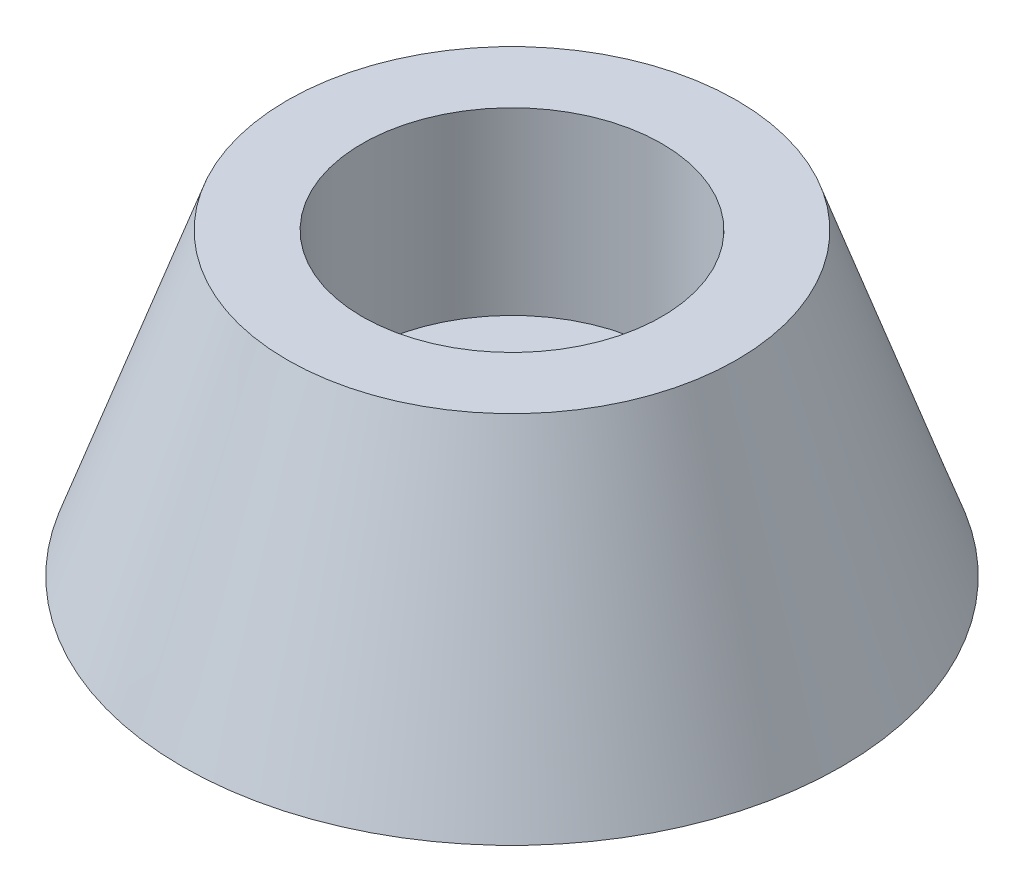
ISO-10303-21;
HEADER;
FILE_DESCRIPTION(('STEP AP214'),'2;1');
FILE_NAME('part.step','',(''),(''),'','','');
FILE_SCHEMA(('AUTOMOTIVE_DESIGN { 1 0 10303 214 1 1 1 1 }'));
ENDSEC;
DATA;
#1=APPLICATION_CONTEXT('core data for automotive mechanical design processes');
#2=APPLICATION_PROTOCOL_DEFINITION('international standard','automotive_design',2000,#1);
#3=PRODUCT_CONTEXT('',#1,'mechanical');
#4=PRODUCT('Part','Part','',(#3));
#5=PRODUCT_RELATED_PRODUCT_CATEGORY('part','',(#4));
#6=PRODUCT_DEFINITION_FORMATION('','',#4);
#7=PRODUCT_DEFINITION_CONTEXT('part definition',#1,'design');
#8=PRODUCT_DEFINITION('design','',#6,#7);
#9=PRODUCT_DEFINITION_SHAPE('','',#8);
#10=(LENGTH_UNIT() NAMED_UNIT(*) SI_UNIT(.MILLI.,.METRE.));
#11=(NAMED_UNIT(*) PLANE_ANGLE_UNIT() SI_UNIT($,.RADIAN.));
#12=(NAMED_UNIT(*) SI_UNIT($,.STERADIAN.) SOLID_ANGLE_UNIT());
#13=UNCERTAINTY_MEASURE_WITH_UNIT(LENGTH_MEASURE(1.E-05),#10,'distance_accuracy_value','');
#14=(GEOMETRIC_REPRESENTATION_CONTEXT(3) GLOBAL_UNCERTAINTY_ASSIGNED_CONTEXT((#13)) GLOBAL_UNIT_ASSIGNED_CONTEXT((#10,
#11,#12)) REPRESENTATION_CONTEXT('',''));
#15=CARTESIAN_POINT('',(0.,0.,0.));
#16=DIRECTION('',(0.,0.,1.));
#17=DIRECTION('',(1.,0.,0.));
#18=AXIS2_PLACEMENT_3D('',#15,#16,#17);
#19=CARTESIAN_POINT('',(0.,-5.63297872340425,0.));
#20=DIRECTION('',(0.,1.,0.));
#21=DIRECTION('',(0.,0.,1.));
#22=AXIS2_PLACEMENT_3D('',#19,#20,#21);
#23=CYLINDRICAL_SURFACE('',#22,2.25);
#24=CARTESIAN_POINT('',(0.,-5.63297872340425,0.));
#25=DIRECTION('',(0.,1.,0.));
#26=DIRECTION('',(0.,0.,1.));
#27=AXIS2_PLACEMENT_3D('',#24,#25,#26);
#28=CIRCLE('',#27,2.25);
#29=CARTESIAN_POINT('',(0.,-5.63297872340425,2.25));
#30=VERTEX_POINT('',#29);
#31=EDGE_CURVE('E44',#30,#30,#28,.T.);
#32=ORIENTED_EDGE('',*,*,#31,.F.);
#33=EDGE_LOOP('',(#32));
#34=FACE_BOUND('',#33,.T.);
#35=CARTESIAN_POINT('',(0.,-1.63297872340425,0.));
#36=DIRECTION('',(0.,1.,0.));
#37=DIRECTION('',(0.,0.,1.));
#38=AXIS2_PLACEMENT_3D('',#35,#36,#37);
#39=CIRCLE('',#38,2.25);
#40=CARTESIAN_POINT('',(0.,-1.63297872340425,2.25));
#41=VERTEX_POINT('',#40);
#42=EDGE_CURVE('E36',#41,#41,#39,.F.);
#43=ORIENTED_EDGE('',*,*,#42,.F.);
#44=EDGE_LOOP('',(#43));
#45=FACE_BOUND('',#44,.T.);
#46=ADVANCED_FACE('F32',(#34,#45),#23,.F.);
#47=CARTESIAN_POINT('',(0.,4.36702127659575,0.));
#48=DIRECTION('',(0.,-1.,0.));
#49=DIRECTION('',(0.,0.,-1.));
#50=AXIS2_PLACEMENT_3D('',#47,#48,#49);
#51=PLANE('',#50);
#52=CARTESIAN_POINT('',(0.,4.36702127659575,0.));
#53=DIRECTION('',(0.,1.,0.));
#54=DIRECTION('',(0.,0.,1.));
#55=AXIS2_PLACEMENT_3D('',#52,#53,#54);
#56=CIRCLE('',#55,5.);
#57=CARTESIAN_POINT('',(0.,4.36702127659575,5.));
#58=VERTEX_POINT('',#57);
#59=EDGE_CURVE('E49',#58,#58,#56,.T.);
#60=ORIENTED_EDGE('',*,*,#59,.F.);
#61=EDGE_LOOP('',(#60));
#62=FACE_BOUND('',#61,.T.);
#63=CARTESIAN_POINT('',(0.,4.36702127659575,0.));
#64=DIRECTION('',(0.,-1.,0.));
#65=DIRECTION('',(0.,0.,-1.));
#66=AXIS2_PLACEMENT_3D('',#63,#64,#65);
#67=CIRCLE('',#66,7.5);
#68=CARTESIAN_POINT('',(0.,4.36702127659575,-7.5));
#69=VERTEX_POINT('',#68);
#70=EDGE_CURVE('E10',#69,#69,#67,.T.);
#71=ORIENTED_EDGE('',*,*,#70,.F.);
#72=EDGE_LOOP('',(#71));
#73=FACE_BOUND('',#72,.T.);
#74=ADVANCED_FACE('F34',(#62,#73),#51,.F.);
#75=CARTESIAN_POINT('',(0.,4.36702127659575,0.));
#76=DIRECTION('',(0.,-1.,0.));
#77=DIRECTION('',(0.,0.,-1.));
#78=AXIS2_PLACEMENT_3D('',#75,#76,#77);
#79=CONICAL_SURFACE('',#78,7.5,0.336674819386727);
#80=CARTESIAN_POINT('',(0.,-5.63297872340425,0.));
#81=DIRECTION('',(0.,-1.,0.));
#82=DIRECTION('',(0.,0.,-1.));
#83=AXIS2_PLACEMENT_3D('',#80,#81,#82);
#84=CIRCLE('',#83,11.);
#85=CARTESIAN_POINT('',(0.,-5.63297872340425,-11.));
#86=VERTEX_POINT('',#85);
#87=EDGE_CURVE('E40',#86,#86,#84,.T.);
#88=ORIENTED_EDGE('',*,*,#87,.F.);
#89=EDGE_LOOP('',(#88));
#90=FACE_BOUND('',#89,.T.);
#91=ORIENTED_EDGE('',*,*,#70,.T.);
#92=EDGE_LOOP('',(#91));
#93=FACE_BOUND('',#92,.T.);
#94=ADVANCED_FACE('F67',(#90,#93),#79,.T.);
#95=CARTESIAN_POINT('',(-11.,-5.63297872340425,0.));
#96=DIRECTION('',(0.,1.,0.));
#97=DIRECTION('',(0.,0.,1.));
#98=AXIS2_PLACEMENT_3D('',#95,#96,#97);
#99=PLANE('',#98);
#100=ORIENTED_EDGE('',*,*,#31,.T.);
#101=EDGE_LOOP('',(#100));
#102=FACE_BOUND('',#101,.T.);
#103=ORIENTED_EDGE('',*,*,#87,.T.);
#104=EDGE_LOOP('',(#103));
#105=FACE_BOUND('',#104,.T.);
#106=ADVANCED_FACE('F74',(#102,#105),#99,.F.);
#107=CARTESIAN_POINT('',(0.,-1.63297872340425,0.));
#108=DIRECTION('',(0.,1.,0.));
#109=DIRECTION('',(0.,0.,1.));
#110=AXIS2_PLACEMENT_3D('',#107,#108,#109);
#111=PLANE('',#110);
#112=CARTESIAN_POINT('',(0.,-1.63297872340425,0.));
#113=DIRECTION('',(0.,1.,0.));
#114=DIRECTION('',(0.,0.,1.));
#115=AXIS2_PLACEMENT_3D('',#112,#113,#114);
#116=CIRCLE('',#115,5.);
#117=CARTESIAN_POINT('',(0.,-1.63297872340425,5.));
#118=VERTEX_POINT('',#117);
#119=EDGE_CURVE('E52',#118,#118,#116,.T.);
#120=ORIENTED_EDGE('',*,*,#119,.T.);
#121=EDGE_LOOP('',(#120));
#122=FACE_BOUND('',#121,.T.);
#123=ORIENTED_EDGE('',*,*,#42,.T.);
#124=EDGE_LOOP('',(#123));
#125=FACE_BOUND('',#124,.T.);
#126=ADVANCED_FACE('F59',(#122,#125),#111,.T.);
#127=CARTESIAN_POINT('',(0.,-1.63297872340425,0.));
#128=DIRECTION('',(0.,1.,0.));
#129=DIRECTION('',(0.,0.,1.));
#130=AXIS2_PLACEMENT_3D('',#127,#128,#129);
#131=CYLINDRICAL_SURFACE('',#130,5.);
#132=ORIENTED_EDGE('',*,*,#119,.F.);
#133=EDGE_LOOP('',(#132));
#134=FACE_BOUND('',#133,.T.);
#135=ORIENTED_EDGE('',*,*,#59,.T.);
#136=EDGE_LOOP('',(#135));
#137=FACE_BOUND('',#136,.T.);
#138=ADVANCED_FACE('F72',(#134,#137),#131,.F.);
#139=CLOSED_SHELL('',(#46,#74,#94,#106,#126,#138));
#140=MANIFOLD_SOLID_BREP('B2',#139);
#141=ADVANCED_BREP_SHAPE_REPRESENTATION('',(#18,#140),#14);
#142=SHAPE_DEFINITION_REPRESENTATION(#9,#141);
ENDSEC;
END-ISO-10303-21;
